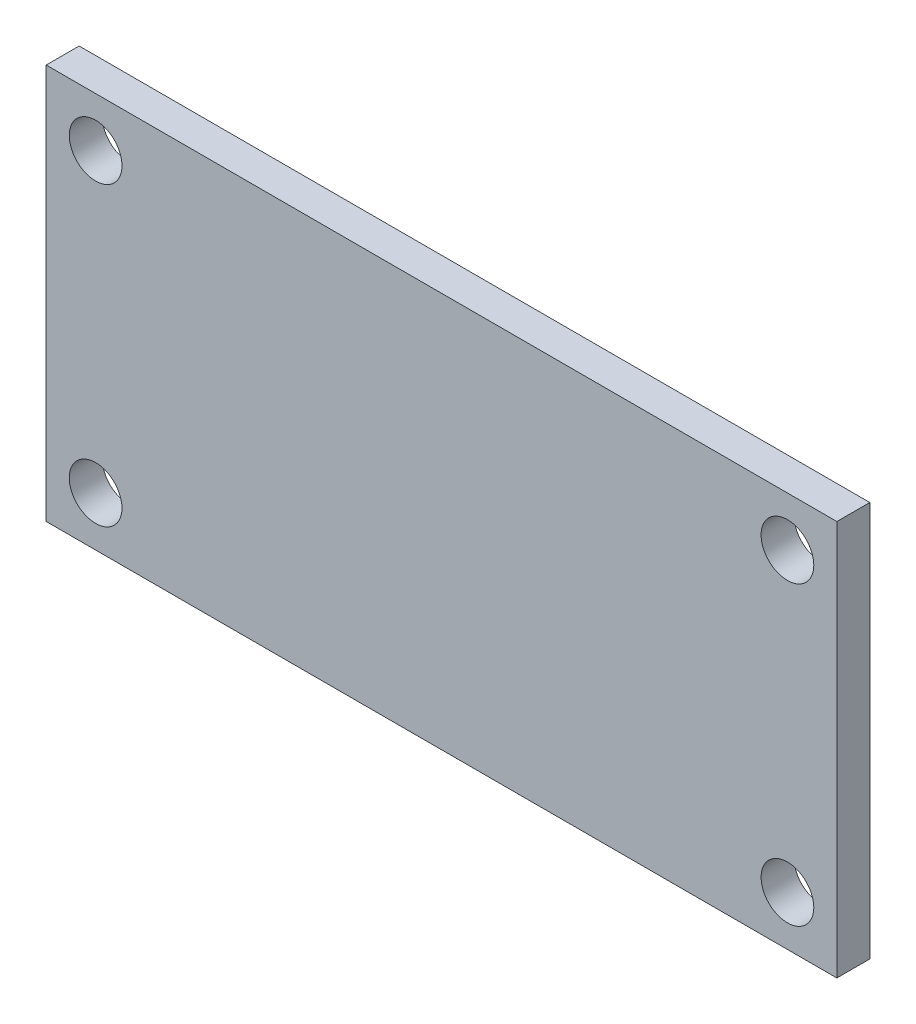
ISO-10303-21;
HEADER;
FILE_DESCRIPTION(('STEP AP214'),'2;1');
FILE_NAME('part.step','',(''),(''),'','','');
FILE_SCHEMA(('AUTOMOTIVE_DESIGN { 1 0 10303 214 1 1 1 1 }'));
ENDSEC;
DATA;
#1=APPLICATION_CONTEXT('core data for automotive mechanical design processes');
#2=APPLICATION_PROTOCOL_DEFINITION('international standard','automotive_design',2000,#1);
#3=PRODUCT_CONTEXT('',#1,'mechanical');
#4=PRODUCT('Part','Part','',(#3));
#5=PRODUCT_RELATED_PRODUCT_CATEGORY('part','',(#4));
#6=PRODUCT_DEFINITION_FORMATION('','',#4);
#7=PRODUCT_DEFINITION_CONTEXT('part definition',#1,'design');
#8=PRODUCT_DEFINITION('design','',#6,#7);
#9=PRODUCT_DEFINITION_SHAPE('','',#8);
#10=(LENGTH_UNIT() NAMED_UNIT(*) SI_UNIT(.MILLI.,.METRE.));
#11=(NAMED_UNIT(*) PLANE_ANGLE_UNIT() SI_UNIT($,.RADIAN.));
#12=(NAMED_UNIT(*) SI_UNIT($,.STERADIAN.) SOLID_ANGLE_UNIT());
#13=UNCERTAINTY_MEASURE_WITH_UNIT(LENGTH_MEASURE(1.E-05),#10,'distance_accuracy_value','');
#14=(GEOMETRIC_REPRESENTATION_CONTEXT(3) GLOBAL_UNCERTAINTY_ASSIGNED_CONTEXT((#13)) GLOBAL_UNIT_ASSIGNED_CONTEXT((#10,
#11,#12)) REPRESENTATION_CONTEXT('',''));
#15=CARTESIAN_POINT('',(0.,0.,0.));
#16=DIRECTION('',(0.,0.,1.));
#17=DIRECTION('',(1.,0.,0.));
#18=AXIS2_PLACEMENT_3D('',#15,#16,#17);
#19=CARTESIAN_POINT('',(0.,0.,2.));
#20=DIRECTION('',(0.,0.,-1.));
#21=DIRECTION('',(-1.,0.,0.));
#22=AXIS2_PLACEMENT_3D('',#19,#20,#21);
#23=PLANE('',#22);
#24=DIRECTION('',(0.,-1.,0.));
#25=VECTOR('',#24,1.);
#26=CARTESIAN_POINT('',(0.,0.,2.));
#27=LINE('',#26,#25);
#28=CARTESIAN_POINT('',(0.,24.,2.));
#29=VERTEX_POINT('',#28);
#30=CARTESIAN_POINT('',(0.,0.,2.));
#31=VERTEX_POINT('',#30);
#32=EDGE_CURVE('E96',#29,#31,#27,.T.);
#33=ORIENTED_EDGE('',*,*,#32,.T.);
#34=DIRECTION('',(1.,0.,0.));
#35=VECTOR('',#34,1.);
#36=CARTESIAN_POINT('',(0.,0.,2.));
#37=LINE('',#36,#35);
#38=CARTESIAN_POINT('',(48.,0.,2.));
#39=VERTEX_POINT('',#38);
#40=EDGE_CURVE('E91',#31,#39,#37,.T.);
#41=ORIENTED_EDGE('',*,*,#40,.T.);
#42=DIRECTION('',(0.,1.,0.));
#43=VECTOR('',#42,1.);
#44=CARTESIAN_POINT('',(48.,0.,2.));
#45=LINE('',#44,#43);
#46=CARTESIAN_POINT('',(48.,24.,2.));
#47=VERTEX_POINT('',#46);
#48=EDGE_CURVE('E94',#39,#47,#45,.T.);
#49=ORIENTED_EDGE('',*,*,#48,.T.);
#50=DIRECTION('',(-1.,0.,0.));
#51=VECTOR('',#50,1.);
#52=CARTESIAN_POINT('',(0.,24.,2.));
#53=LINE('',#52,#51);
#54=EDGE_CURVE('E61',#47,#29,#53,.T.);
#55=ORIENTED_EDGE('',*,*,#54,.T.);
#56=EDGE_LOOP('',(#33,#41,#49,#55));
#57=FACE_BOUND('',#56,.T.);
#58=CARTESIAN_POINT('',(3.,3.,2.));
#59=DIRECTION('',(0.,0.,1.));
#60=DIRECTION('',(1.,0.,0.));
#61=AXIS2_PLACEMENT_3D('',#58,#59,#60);
#62=CIRCLE('',#61,1.6);
#63=CARTESIAN_POINT('',(4.6,3.,2.));
#64=VERTEX_POINT('',#63);
#65=EDGE_CURVE('E116',#64,#64,#62,.T.);
#66=ORIENTED_EDGE('',*,*,#65,.F.);
#67=EDGE_LOOP('',(#66));
#68=FACE_BOUND('',#67,.T.);
#69=CARTESIAN_POINT('',(3.,21.,2.));
#70=DIRECTION('',(0.,0.,1.));
#71=DIRECTION('',(1.,0.,0.));
#72=AXIS2_PLACEMENT_3D('',#69,#70,#71);
#73=CIRCLE('',#72,1.6);
#74=CARTESIAN_POINT('',(4.6,21.,2.));
#75=VERTEX_POINT('',#74);
#76=EDGE_CURVE('E138',#75,#75,#73,.T.);
#77=ORIENTED_EDGE('',*,*,#76,.F.);
#78=EDGE_LOOP('',(#77));
#79=FACE_BOUND('',#78,.T.);
#80=CARTESIAN_POINT('',(45.,21.,2.));
#81=DIRECTION('',(0.,0.,1.));
#82=DIRECTION('',(1.,0.,0.));
#83=AXIS2_PLACEMENT_3D('',#80,#81,#82);
#84=CIRCLE('',#83,1.6);
#85=CARTESIAN_POINT('',(46.6,21.,2.));
#86=VERTEX_POINT('',#85);
#87=EDGE_CURVE('E146',#86,#86,#84,.T.);
#88=ORIENTED_EDGE('',*,*,#87,.F.);
#89=EDGE_LOOP('',(#88));
#90=FACE_BOUND('',#89,.T.);
#91=CARTESIAN_POINT('',(45.,3.,2.));
#92=DIRECTION('',(0.,0.,1.));
#93=DIRECTION('',(1.,0.,0.));
#94=AXIS2_PLACEMENT_3D('',#91,#92,#93);
#95=CIRCLE('',#94,1.6);
#96=CARTESIAN_POINT('',(46.6,3.,2.));
#97=VERTEX_POINT('',#96);
#98=EDGE_CURVE('E154',#97,#97,#95,.T.);
#99=ORIENTED_EDGE('',*,*,#98,.F.);
#100=EDGE_LOOP('',(#99));
#101=FACE_BOUND('',#100,.T.);
#102=ADVANCED_FACE('F43',(#57,#68,#79,#90,#101),#23,.F.);
#103=CARTESIAN_POINT('',(0.,0.,0.));
#104=DIRECTION('',(0.,0.,-1.));
#105=DIRECTION('',(-1.,0.,0.));
#106=AXIS2_PLACEMENT_3D('',#103,#104,#105);
#107=PLANE('',#106);
#108=CARTESIAN_POINT('',(45.,21.,0.));
#109=DIRECTION('',(0.,0.,1.));
#110=DIRECTION('',(1.,0.,0.));
#111=AXIS2_PLACEMENT_3D('',#108,#109,#110);
#112=CIRCLE('',#111,1.6);
#113=CARTESIAN_POINT('',(46.6,21.,0.));
#114=VERTEX_POINT('',#113);
#115=EDGE_CURVE('E150',#114,#114,#112,.T.);
#116=ORIENTED_EDGE('',*,*,#115,.T.);
#117=EDGE_LOOP('',(#116));
#118=FACE_BOUND('',#117,.T.);
#119=CARTESIAN_POINT('',(3.,3.,0.));
#120=DIRECTION('',(0.,0.,1.));
#121=DIRECTION('',(1.,0.,0.));
#122=AXIS2_PLACEMENT_3D('',#119,#120,#121);
#123=CIRCLE('',#122,1.6);
#124=CARTESIAN_POINT('',(4.6,3.,0.));
#125=VERTEX_POINT('',#124);
#126=EDGE_CURVE('E134',#125,#125,#123,.T.);
#127=ORIENTED_EDGE('',*,*,#126,.T.);
#128=EDGE_LOOP('',(#127));
#129=FACE_BOUND('',#128,.T.);
#130=DIRECTION('',(0.,-1.,0.));
#131=VECTOR('',#130,1.);
#132=CARTESIAN_POINT('',(0.,0.,0.));
#133=LINE('',#132,#131);
#134=CARTESIAN_POINT('',(0.,24.,0.));
#135=VERTEX_POINT('',#134);
#136=CARTESIAN_POINT('',(0.,0.,0.));
#137=VERTEX_POINT('',#136);
#138=EDGE_CURVE('E112',#135,#137,#133,.T.);
#139=ORIENTED_EDGE('',*,*,#138,.F.);
#140=DIRECTION('',(-1.,0.,0.));
#141=VECTOR('',#140,1.);
#142=CARTESIAN_POINT('',(0.,24.,0.));
#143=LINE('',#142,#141);
#144=CARTESIAN_POINT('',(48.,24.,0.));
#145=VERTEX_POINT('',#144);
#146=EDGE_CURVE('E84',#145,#135,#143,.T.);
#147=ORIENTED_EDGE('',*,*,#146,.F.);
#148=DIRECTION('',(0.,1.,0.));
#149=VECTOR('',#148,1.);
#150=CARTESIAN_POINT('',(48.,0.,0.));
#151=LINE('',#150,#149);
#152=CARTESIAN_POINT('',(48.,0.,0.));
#153=VERTEX_POINT('',#152);
#154=EDGE_CURVE('E78',#153,#145,#151,.T.);
#155=ORIENTED_EDGE('',*,*,#154,.F.);
#156=DIRECTION('',(1.,0.,0.));
#157=VECTOR('',#156,1.);
#158=CARTESIAN_POINT('',(0.,0.,0.));
#159=LINE('',#158,#157);
#160=EDGE_CURVE('E101',#137,#153,#159,.T.);
#161=ORIENTED_EDGE('',*,*,#160,.F.);
#162=EDGE_LOOP('',(#139,#147,#155,#161));
#163=FACE_BOUND('',#162,.T.);
#164=CARTESIAN_POINT('',(3.,21.,0.));
#165=DIRECTION('',(0.,0.,1.));
#166=DIRECTION('',(1.,0.,0.));
#167=AXIS2_PLACEMENT_3D('',#164,#165,#166);
#168=CIRCLE('',#167,1.6);
#169=CARTESIAN_POINT('',(4.6,21.,0.));
#170=VERTEX_POINT('',#169);
#171=EDGE_CURVE('E142',#170,#170,#168,.T.);
#172=ORIENTED_EDGE('',*,*,#171,.T.);
#173=EDGE_LOOP('',(#172));
#174=FACE_BOUND('',#173,.T.);
#175=CARTESIAN_POINT('',(45.,3.,0.));
#176=DIRECTION('',(0.,0.,1.));
#177=DIRECTION('',(1.,0.,0.));
#178=AXIS2_PLACEMENT_3D('',#175,#176,#177);
#179=CIRCLE('',#178,1.6);
#180=CARTESIAN_POINT('',(46.6,3.,0.));
#181=VERTEX_POINT('',#180);
#182=EDGE_CURVE('E158',#181,#181,#179,.T.);
#183=ORIENTED_EDGE('',*,*,#182,.T.);
#184=EDGE_LOOP('',(#183));
#185=FACE_BOUND('',#184,.T.);
#186=ADVANCED_FACE('F129',(#118,#129,#163,#174,#185),#107,.T.);
#187=CARTESIAN_POINT('',(0.,0.,2.));
#188=DIRECTION('',(1.,0.,0.));
#189=DIRECTION('',(0.,0.,-1.));
#190=AXIS2_PLACEMENT_3D('',#187,#188,#189);
#191=PLANE('',#190);
#192=ORIENTED_EDGE('',*,*,#138,.T.);
#193=DIRECTION('',(0.,0.,-1.));
#194=VECTOR('',#193,1.);
#195=CARTESIAN_POINT('',(0.,0.,2.));
#196=LINE('',#195,#194);
#197=EDGE_CURVE('E11',#31,#137,#196,.T.);
#198=ORIENTED_EDGE('',*,*,#197,.F.);
#199=ORIENTED_EDGE('',*,*,#32,.F.);
#200=DIRECTION('',(0.,0.,-1.));
#201=VECTOR('',#200,1.);
#202=CARTESIAN_POINT('',(0.,24.,2.));
#203=LINE('',#202,#201);
#204=EDGE_CURVE('E108',#29,#135,#203,.T.);
#205=ORIENTED_EDGE('',*,*,#204,.T.);
#206=EDGE_LOOP('',(#192,#198,#199,#205));
#207=FACE_BOUND('',#206,.T.);
#208=ADVANCED_FACE('F45',(#207),#191,.F.);
#209=CARTESIAN_POINT('',(0.,0.,2.));
#210=DIRECTION('',(0.,1.,0.));
#211=DIRECTION('',(0.,0.,1.));
#212=AXIS2_PLACEMENT_3D('',#209,#210,#211);
#213=PLANE('',#212);
#214=ORIENTED_EDGE('',*,*,#160,.T.);
#215=DIRECTION('',(0.,0.,-1.));
#216=VECTOR('',#215,1.);
#217=CARTESIAN_POINT('',(48.,0.,2.));
#218=LINE('',#217,#216);
#219=EDGE_CURVE('E53',#39,#153,#218,.T.);
#220=ORIENTED_EDGE('',*,*,#219,.F.);
#221=ORIENTED_EDGE('',*,*,#40,.F.);
#222=ORIENTED_EDGE('',*,*,#197,.T.);
#223=EDGE_LOOP('',(#214,#220,#221,#222));
#224=FACE_BOUND('',#223,.T.);
#225=ADVANCED_FACE('F100',(#224),#213,.F.);
#226=CARTESIAN_POINT('',(48.,0.,2.));
#227=DIRECTION('',(-1.,0.,0.));
#228=DIRECTION('',(0.,0.,1.));
#229=AXIS2_PLACEMENT_3D('',#226,#227,#228);
#230=PLANE('',#229);
#231=ORIENTED_EDGE('',*,*,#154,.T.);
#232=DIRECTION('',(0.,0.,-1.));
#233=VECTOR('',#232,1.);
#234=CARTESIAN_POINT('',(48.,24.,2.));
#235=LINE('',#234,#233);
#236=EDGE_CURVE('E103',#47,#145,#235,.T.);
#237=ORIENTED_EDGE('',*,*,#236,.F.);
#238=ORIENTED_EDGE('',*,*,#48,.F.);
#239=ORIENTED_EDGE('',*,*,#219,.T.);
#240=EDGE_LOOP('',(#231,#237,#238,#239));
#241=FACE_BOUND('',#240,.T.);
#242=ADVANCED_FACE('F104',(#241),#230,.F.);
#243=CARTESIAN_POINT('',(0.,24.,2.));
#244=DIRECTION('',(0.,-1.,0.));
#245=DIRECTION('',(0.,0.,-1.));
#246=AXIS2_PLACEMENT_3D('',#243,#244,#245);
#247=PLANE('',#246);
#248=ORIENTED_EDGE('',*,*,#146,.T.);
#249=ORIENTED_EDGE('',*,*,#204,.F.);
#250=ORIENTED_EDGE('',*,*,#54,.F.);
#251=ORIENTED_EDGE('',*,*,#236,.T.);
#252=EDGE_LOOP('',(#248,#249,#250,#251));
#253=FACE_BOUND('',#252,.T.);
#254=ADVANCED_FACE('F126',(#253),#247,.F.);
#255=CARTESIAN_POINT('',(3.,3.,2.));
#256=DIRECTION('',(0.,0.,-1.));
#257=DIRECTION('',(-1.,0.,0.));
#258=AXIS2_PLACEMENT_3D('',#255,#256,#257);
#259=CYLINDRICAL_SURFACE('',#258,1.6);
#260=ORIENTED_EDGE('',*,*,#65,.T.);
#261=EDGE_LOOP('',(#260));
#262=FACE_BOUND('',#261,.T.);
#263=ORIENTED_EDGE('',*,*,#126,.F.);
#264=EDGE_LOOP('',(#263));
#265=FACE_BOUND('',#264,.T.);
#266=ADVANCED_FACE('F177',(#262,#265),#259,.F.);
#267=CARTESIAN_POINT('',(3.,21.,2.));
#268=DIRECTION('',(0.,0.,-1.));
#269=DIRECTION('',(-1.,0.,0.));
#270=AXIS2_PLACEMENT_3D('',#267,#268,#269);
#271=CYLINDRICAL_SURFACE('',#270,1.6);
#272=ORIENTED_EDGE('',*,*,#76,.T.);
#273=EDGE_LOOP('',(#272));
#274=FACE_BOUND('',#273,.T.);
#275=ORIENTED_EDGE('',*,*,#171,.F.);
#276=EDGE_LOOP('',(#275));
#277=FACE_BOUND('',#276,.T.);
#278=ADVANCED_FACE('F231',(#274,#277),#271,.F.);
#279=CARTESIAN_POINT('',(45.,21.,2.));
#280=DIRECTION('',(0.,0.,-1.));
#281=DIRECTION('',(-1.,0.,0.));
#282=AXIS2_PLACEMENT_3D('',#279,#280,#281);
#283=CYLINDRICAL_SURFACE('',#282,1.6);
#284=ORIENTED_EDGE('',*,*,#87,.T.);
#285=EDGE_LOOP('',(#284));
#286=FACE_BOUND('',#285,.T.);
#287=ORIENTED_EDGE('',*,*,#115,.F.);
#288=EDGE_LOOP('',(#287));
#289=FACE_BOUND('',#288,.T.);
#290=ADVANCED_FACE('F240',(#286,#289),#283,.F.);
#291=CARTESIAN_POINT('',(45.,3.,2.));
#292=DIRECTION('',(0.,0.,-1.));
#293=DIRECTION('',(-1.,0.,0.));
#294=AXIS2_PLACEMENT_3D('',#291,#292,#293);
#295=CYLINDRICAL_SURFACE('',#294,1.6);
#296=ORIENTED_EDGE('',*,*,#98,.T.);
#297=EDGE_LOOP('',(#296));
#298=FACE_BOUND('',#297,.T.);
#299=ORIENTED_EDGE('',*,*,#182,.F.);
#300=EDGE_LOOP('',(#299));
#301=FACE_BOUND('',#300,.T.);
#302=ADVANCED_FACE('F166',(#298,#301),#295,.F.);
#303=CLOSED_SHELL('',(#102,#186,#208,#225,#242,#254,#266,#278,#290,#302));
#304=MANIFOLD_SOLID_BREP('B2',#303);
#305=ADVANCED_BREP_SHAPE_REPRESENTATION('',(#18,#304),#14);
#306=SHAPE_DEFINITION_REPRESENTATION(#9,#305);
ENDSEC;
END-ISO-10303-21;
